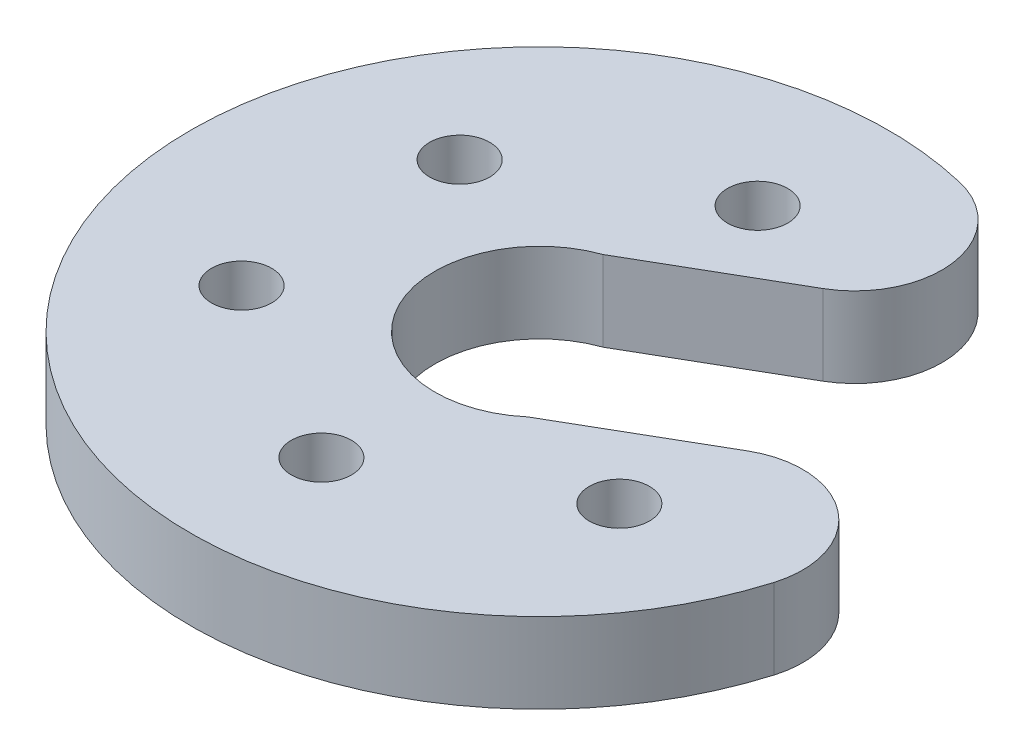
ISO-10303-21;
HEADER;
FILE_DESCRIPTION(('STEP AP214'),'2;1');
FILE_NAME('part.step','',(''),(''),'','','');
FILE_SCHEMA(('AUTOMOTIVE_DESIGN { 1 0 10303 214 1 1 1 1 }'));
ENDSEC;
DATA;
#1=APPLICATION_CONTEXT('core data for automotive mechanical design processes');
#2=APPLICATION_PROTOCOL_DEFINITION('international standard','automotive_design',2000,#1);
#3=PRODUCT_CONTEXT('',#1,'mechanical');
#4=PRODUCT('Part','Part','',(#3));
#5=PRODUCT_RELATED_PRODUCT_CATEGORY('part','',(#4));
#6=PRODUCT_DEFINITION_FORMATION('','',#4);
#7=PRODUCT_DEFINITION_CONTEXT('part definition',#1,'design');
#8=PRODUCT_DEFINITION('design','',#6,#7);
#9=PRODUCT_DEFINITION_SHAPE('','',#8);
#10=(LENGTH_UNIT() NAMED_UNIT(*) SI_UNIT(.MILLI.,.METRE.));
#11=(NAMED_UNIT(*) PLANE_ANGLE_UNIT() SI_UNIT($,.RADIAN.));
#12=(NAMED_UNIT(*) SI_UNIT($,.STERADIAN.) SOLID_ANGLE_UNIT());
#13=UNCERTAINTY_MEASURE_WITH_UNIT(LENGTH_MEASURE(1.E-05),#10,'distance_accuracy_value','');
#14=(GEOMETRIC_REPRESENTATION_CONTEXT(3) GLOBAL_UNCERTAINTY_ASSIGNED_CONTEXT((#13)) GLOBAL_UNIT_ASSIGNED_CONTEXT((#10,
#11,#12)) REPRESENTATION_CONTEXT('',''));
#15=CARTESIAN_POINT('',(0.,0.,0.));
#16=DIRECTION('',(0.,0.,1.));
#17=DIRECTION('',(1.,0.,0.));
#18=AXIS2_PLACEMENT_3D('',#15,#16,#17);
#19=CARTESIAN_POINT('',(0.,4.6,0.));
#20=DIRECTION('',(0.,1.,0.));
#21=DIRECTION('',(0.,0.,1.));
#22=AXIS2_PLACEMENT_3D('',#19,#20,#21);
#23=PLANE('',#22);
#24=CARTESIAN_POINT('',(-10.8253175473055,4.6,-6.24999999999999));
#25=DIRECTION('',(0.,1.,0.));
#26=DIRECTION('',(0.,0.,1.));
#27=AXIS2_PLACEMENT_3D('',#24,#25,#26);
#28=CIRCLE('',#27,1.72500000000015);
#29=CARTESIAN_POINT('',(-10.8253175473055,4.6,-4.52499999999984));
#30=VERTEX_POINT('',#29);
#31=EDGE_CURVE('E146',#30,#30,#28,.T.);
#32=ORIENTED_EDGE('',*,*,#31,.F.);
#33=EDGE_LOOP('',(#32));
#34=FACE_BOUND('',#33,.T.);
#35=CARTESIAN_POINT('',(0.,4.6,12.5));
#36=DIRECTION('',(0.,1.,0.));
#37=DIRECTION('',(0.,0.,1.));
#38=AXIS2_PLACEMENT_3D('',#35,#36,#37);
#39=CIRCLE('',#38,1.72500000000009);
#40=CARTESIAN_POINT('',(0.,4.6,14.2250000000001));
#41=VERTEX_POINT('',#40);
#42=EDGE_CURVE('E158',#41,#41,#39,.T.);
#43=ORIENTED_EDGE('',*,*,#42,.F.);
#44=EDGE_LOOP('',(#43));
#45=FACE_BOUND('',#44,.T.);
#46=CARTESIAN_POINT('',(0.,4.6,-12.5));
#47=DIRECTION('',(0.,1.,0.));
#48=DIRECTION('',(0.,0.,1.));
#49=AXIS2_PLACEMENT_3D('',#46,#47,#48);
#50=CIRCLE('',#49,1.725);
#51=CARTESIAN_POINT('',(0.,4.6,-10.775));
#52=VERTEX_POINT('',#51);
#53=EDGE_CURVE('E113',#52,#52,#50,.T.);
#54=ORIENTED_EDGE('',*,*,#53,.F.);
#55=EDGE_LOOP('',(#54));
#56=FACE_BOUND('',#55,.T.);
#57=CARTESIAN_POINT('',(10.8253175473055,4.6,6.25));
#58=DIRECTION('',(0.,1.,0.));
#59=DIRECTION('',(0.,0.,1.));
#60=AXIS2_PLACEMENT_3D('',#57,#58,#59);
#61=CIRCLE('',#60,1.72500000000006);
#62=CARTESIAN_POINT('',(10.8253175473055,4.6,7.97500000000006));
#63=VERTEX_POINT('',#62);
#64=EDGE_CURVE('E164',#63,#63,#61,.T.);
#65=ORIENTED_EDGE('',*,*,#64,.F.);
#66=EDGE_LOOP('',(#65));
#67=FACE_BOUND('',#66,.T.);
#68=CARTESIAN_POINT('',(-10.8253175473055,4.6,6.25000000000001));
#69=DIRECTION('',(0.,1.,0.));
#70=DIRECTION('',(0.,0.,1.));
#71=AXIS2_PLACEMENT_3D('',#68,#69,#70);
#72=CIRCLE('',#71,1.72500000000012);
#73=CARTESIAN_POINT('',(-10.8253175473055,4.6,7.97500000000013));
#74=VERTEX_POINT('',#73);
#75=EDGE_CURVE('E152',#74,#74,#72,.T.);
#76=ORIENTED_EDGE('',*,*,#75,.F.);
#77=EDGE_LOOP('',(#76));
#78=FACE_BOUND('',#77,.T.);
#79=CARTESIAN_POINT('',(0.,4.6,0.));
#80=DIRECTION('',(0.,1.,0.));
#81=DIRECTION('',(0.,0.,1.));
#82=AXIS2_PLACEMENT_3D('',#79,#80,#81);
#83=CIRCLE('',#82,20.);
#84=CARTESIAN_POINT('',(4.6323529007879,4.6,-19.4561380186964));
#85=VERTEX_POINT('',#84);
#86=CARTESIAN_POINT('',(19.1656862341212,4.6,5.71633371797131));
#87=VERTEX_POINT('',#86);
#88=EDGE_CURVE('E105',#85,#87,#83,.T.);
#89=ORIENTED_EDGE('',*,*,#88,.T.);
#90=CARTESIAN_POINT('',(14.3742646755909,4.6,4.28725028847848));
#91=DIRECTION('',(0.,1.,0.));
#92=DIRECTION('',(0.,0.,1.));
#93=AXIS2_PLACEMENT_3D('',#90,#91,#92);
#94=CIRCLE('',#93,5.);
#95=CARTESIAN_POINT('',(11.8742646755909,4.6,-0.0428767304437106));
#96=VERTEX_POINT('',#95);
#97=EDGE_CURVE('E40',#87,#96,#94,.T.);
#98=ORIENTED_EDGE('',*,*,#97,.T.);
#99=DIRECTION('',(-0.866025403784439,0.,0.5));
#100=VECTOR('',#99,1.);
#101=CARTESIAN_POINT('',(2.95,4.6,5.10954988232819));
#102=LINE('',#101,#100);
#103=CARTESIAN_POINT('',(3.89472218138457,4.59999999999999,4.56411427659639));
#104=VERTEX_POINT('',#103);
#105=EDGE_CURVE('E87',#96,#104,#102,.T.);
#106=ORIENTED_EDGE('',*,*,#105,.T.);
#107=CARTESIAN_POINT('',(0.,4.6,0.));
#108=DIRECTION('',(0.,1.,0.));
#109=DIRECTION('',(0.,0.,1.));
#110=AXIS2_PLACEMENT_3D('',#107,#108,#109);
#111=CIRCLE('',#110,6.);
#112=CARTESIAN_POINT('',(-2.00527781861544,4.6,-5.65498548805997));
#113=VERTEX_POINT('',#112);
#114=EDGE_CURVE('E90',#113,#104,#111,.T.);
#115=ORIENTED_EDGE('',*,*,#114,.F.);
#116=DIRECTION('',(0.866025403784439,0.,-0.5));
#117=VECTOR('',#116,1.);
#118=CARTESIAN_POINT('',(-2.95,4.6,-5.10954988232819));
#119=LINE('',#118,#117);
#120=CARTESIAN_POINT('',(5.97426467559093,4.6,-10.2619764951001));
#121=VERTEX_POINT('',#120);
#122=EDGE_CURVE('E132',#113,#121,#119,.T.);
#123=ORIENTED_EDGE('',*,*,#122,.T.);
#124=CARTESIAN_POINT('',(3.47426467559092,4.6,-14.5921035140223));
#125=DIRECTION('',(0.,1.,0.));
#126=DIRECTION('',(0.,0.,1.));
#127=AXIS2_PLACEMENT_3D('',#124,#125,#126);
#128=CIRCLE('',#127,5.);
#129=EDGE_CURVE('E130',#121,#85,#128,.T.);
#130=ORIENTED_EDGE('',*,*,#129,.T.);
#131=EDGE_LOOP('',(#89,#98,#106,#115,#123,#130));
#132=FACE_BOUND('',#131,.T.);
#133=ADVANCED_FACE('F32',(#34,#45,#56,#67,#78,#132),#23,.T.);
#134=CARTESIAN_POINT('',(0.,0.,0.));
#135=DIRECTION('',(0.,1.,0.));
#136=DIRECTION('',(0.,0.,1.));
#137=AXIS2_PLACEMENT_3D('',#134,#135,#136);
#138=PLANE('',#137);
#139=CARTESIAN_POINT('',(-10.8253175473055,0.,-6.24999999999999));
#140=DIRECTION('',(0.,1.,0.));
#141=DIRECTION('',(0.,0.,1.));
#142=AXIS2_PLACEMENT_3D('',#139,#140,#141);
#143=CIRCLE('',#142,1.72500000000015);
#144=CARTESIAN_POINT('',(-10.8253175473055,0.,-4.52499999999984));
#145=VERTEX_POINT('',#144);
#146=EDGE_CURVE('E142',#145,#145,#143,.T.);
#147=ORIENTED_EDGE('',*,*,#146,.T.);
#148=EDGE_LOOP('',(#147));
#149=FACE_BOUND('',#148,.T.);
#150=CARTESIAN_POINT('',(0.,0.,12.5));
#151=DIRECTION('',(0.,1.,0.));
#152=DIRECTION('',(0.,0.,1.));
#153=AXIS2_PLACEMENT_3D('',#150,#151,#152);
#154=CIRCLE('',#153,1.72500000000009);
#155=CARTESIAN_POINT('',(0.,0.,14.2250000000001));
#156=VERTEX_POINT('',#155);
#157=EDGE_CURVE('E155',#156,#156,#154,.T.);
#158=ORIENTED_EDGE('',*,*,#157,.T.);
#159=EDGE_LOOP('',(#158));
#160=FACE_BOUND('',#159,.T.);
#161=CARTESIAN_POINT('',(0.,0.,-12.5));
#162=DIRECTION('',(0.,1.,0.));
#163=DIRECTION('',(0.,0.,1.));
#164=AXIS2_PLACEMENT_3D('',#161,#162,#163);
#165=CIRCLE('',#164,1.725);
#166=CARTESIAN_POINT('',(0.,0.,-10.775));
#167=VERTEX_POINT('',#166);
#168=EDGE_CURVE('E116',#167,#167,#165,.T.);
#169=ORIENTED_EDGE('',*,*,#168,.T.);
#170=EDGE_LOOP('',(#169));
#171=FACE_BOUND('',#170,.T.);
#172=CARTESIAN_POINT('',(10.8253175473055,0.,6.25));
#173=DIRECTION('',(0.,1.,0.));
#174=DIRECTION('',(0.,0.,1.));
#175=AXIS2_PLACEMENT_3D('',#172,#173,#174);
#176=CIRCLE('',#175,1.72500000000006);
#177=CARTESIAN_POINT('',(10.8253175473055,0.,7.97500000000006));
#178=VERTEX_POINT('',#177);
#179=EDGE_CURVE('E161',#178,#178,#176,.T.);
#180=ORIENTED_EDGE('',*,*,#179,.T.);
#181=EDGE_LOOP('',(#180));
#182=FACE_BOUND('',#181,.T.);
#183=CARTESIAN_POINT('',(-10.8253175473055,0.,6.25000000000001));
#184=DIRECTION('',(0.,1.,0.));
#185=DIRECTION('',(0.,0.,1.));
#186=AXIS2_PLACEMENT_3D('',#183,#184,#185);
#187=CIRCLE('',#186,1.72500000000012);
#188=CARTESIAN_POINT('',(-10.8253175473055,0.,7.97500000000013));
#189=VERTEX_POINT('',#188);
#190=EDGE_CURVE('E149',#189,#189,#187,.T.);
#191=ORIENTED_EDGE('',*,*,#190,.T.);
#192=EDGE_LOOP('',(#191));
#193=FACE_BOUND('',#192,.T.);
#194=DIRECTION('',(-0.866025403784439,0.,0.5));
#195=VECTOR('',#194,1.);
#196=CARTESIAN_POINT('',(2.95,0.,5.10954988232819));
#197=LINE('',#196,#195);
#198=CARTESIAN_POINT('',(11.8742646755909,0.,-0.0428767304437106));
#199=VERTEX_POINT('',#198);
#200=CARTESIAN_POINT('',(3.89472218138458,0.,4.56411427659639));
#201=VERTEX_POINT('',#200);
#202=EDGE_CURVE('E96',#199,#201,#197,.T.);
#203=ORIENTED_EDGE('',*,*,#202,.F.);
#204=CARTESIAN_POINT('',(14.3742646755909,0.,4.28725028847848));
#205=DIRECTION('',(0.,1.,0.));
#206=DIRECTION('',(0.,0.,1.));
#207=AXIS2_PLACEMENT_3D('',#204,#205,#206);
#208=CIRCLE('',#207,5.);
#209=CARTESIAN_POINT('',(19.1656862341212,0.,5.71633371797131));
#210=VERTEX_POINT('',#209);
#211=EDGE_CURVE('E124',#199,#210,#208,.F.);
#212=ORIENTED_EDGE('',*,*,#211,.T.);
#213=CARTESIAN_POINT('',(0.,0.,0.));
#214=DIRECTION('',(0.,1.,0.));
#215=DIRECTION('',(0.,0.,1.));
#216=AXIS2_PLACEMENT_3D('',#213,#214,#215);
#217=CIRCLE('',#216,20.);
#218=CARTESIAN_POINT('',(4.6323529007879,0.,-19.4561380186964));
#219=VERTEX_POINT('',#218);
#220=EDGE_CURVE('E109',#219,#210,#217,.T.);
#221=ORIENTED_EDGE('',*,*,#220,.F.);
#222=CARTESIAN_POINT('',(3.47426467559092,0.,-14.5921035140223));
#223=DIRECTION('',(0.,1.,0.));
#224=DIRECTION('',(0.,0.,1.));
#225=AXIS2_PLACEMENT_3D('',#222,#223,#224);
#226=CIRCLE('',#225,5.);
#227=CARTESIAN_POINT('',(5.97426467559093,0.,-10.2619764951001));
#228=VERTEX_POINT('',#227);
#229=EDGE_CURVE('E122',#219,#228,#226,.F.);
#230=ORIENTED_EDGE('',*,*,#229,.T.);
#231=DIRECTION('',(0.866025403784439,0.,-0.5));
#232=VECTOR('',#231,1.);
#233=CARTESIAN_POINT('',(-2.95,0.,-5.10954988232819));
#234=LINE('',#233,#232);
#235=CARTESIAN_POINT('',(-2.00527781861544,0.,-5.65498548805997));
#236=VERTEX_POINT('',#235);
#237=EDGE_CURVE('E95',#236,#228,#234,.T.);
#238=ORIENTED_EDGE('',*,*,#237,.F.);
#239=CARTESIAN_POINT('',(0.,0.,0.));
#240=DIRECTION('',(0.,1.,0.));
#241=DIRECTION('',(0.,0.,1.));
#242=AXIS2_PLACEMENT_3D('',#239,#240,#241);
#243=CIRCLE('',#242,6.);
#244=EDGE_CURVE('E110',#236,#201,#243,.T.);
#245=ORIENTED_EDGE('',*,*,#244,.T.);
#246=EDGE_LOOP('',(#203,#212,#221,#230,#238,#245));
#247=FACE_BOUND('',#246,.T.);
#248=ADVANCED_FACE('F139',(#149,#160,#171,#182,#193,#247),#138,.F.);
#249=CARTESIAN_POINT('',(0.,4.6,0.));
#250=DIRECTION('',(0.,-1.,0.));
#251=DIRECTION('',(0.,0.,-1.));
#252=AXIS2_PLACEMENT_3D('',#249,#250,#251);
#253=CYLINDRICAL_SURFACE('',#252,20.);
#254=ORIENTED_EDGE('',*,*,#220,.T.);
#255=DIRECTION('',(0.,-1.,0.));
#256=VECTOR('',#255,1.);
#257=CARTESIAN_POINT('',(19.1656862341212,4.6,5.71633371797131));
#258=LINE('',#257,#256);
#259=EDGE_CURVE('E53',#210,#87,#258,.F.);
#260=ORIENTED_EDGE('',*,*,#259,.T.);
#261=ORIENTED_EDGE('',*,*,#88,.F.);
#262=DIRECTION('',(0.,-1.,0.));
#263=VECTOR('',#262,1.);
#264=CARTESIAN_POINT('',(4.6323529007879,4.6,-19.4561380186964));
#265=LINE('',#264,#263);
#266=EDGE_CURVE('E126',#85,#219,#265,.T.);
#267=ORIENTED_EDGE('',*,*,#266,.T.);
#268=EDGE_LOOP('',(#254,#260,#261,#267));
#269=FACE_BOUND('',#268,.T.);
#270=ADVANCED_FACE('F135',(#269),#253,.T.);
#271=CARTESIAN_POINT('',(0.,4.6,0.));
#272=DIRECTION('',(0.,-1.,0.));
#273=DIRECTION('',(0.,0.,-1.));
#274=AXIS2_PLACEMENT_3D('',#271,#272,#273);
#275=CYLINDRICAL_SURFACE('',#274,6.);
#276=DIRECTION('',(0.,-1.,0.));
#277=VECTOR('',#276,1.);
#278=CARTESIAN_POINT('',(-2.00527781861544,75.5440800912945,-5.65498548805997));
#279=LINE('',#278,#277);
#280=EDGE_CURVE('E104',#113,#236,#279,.T.);
#281=ORIENTED_EDGE('',*,*,#280,.F.);
#282=ORIENTED_EDGE('',*,*,#114,.T.);
#283=DIRECTION('',(0.,-1.,0.));
#284=VECTOR('',#283,1.);
#285=CARTESIAN_POINT('',(3.89472218138458,4.6,4.56411427659639));
#286=LINE('',#285,#284);
#287=EDGE_CURVE('E99',#104,#201,#286,.T.);
#288=ORIENTED_EDGE('',*,*,#287,.T.);
#289=ORIENTED_EDGE('',*,*,#244,.F.);
#290=EDGE_LOOP('',(#281,#282,#288,#289));
#291=FACE_BOUND('',#290,.T.);
#292=ADVANCED_FACE('F107',(#291),#275,.F.);
#293=CARTESIAN_POINT('',(0.,4.6,-12.5));
#294=DIRECTION('',(0.,-1.,0.));
#295=DIRECTION('',(0.,0.,-1.));
#296=AXIS2_PLACEMENT_3D('',#293,#294,#295);
#297=CYLINDRICAL_SURFACE('',#296,1.725);
#298=ORIENTED_EDGE('',*,*,#53,.T.);
#299=EDGE_LOOP('',(#298));
#300=FACE_BOUND('',#299,.T.);
#301=ORIENTED_EDGE('',*,*,#168,.F.);
#302=EDGE_LOOP('',(#301));
#303=FACE_BOUND('',#302,.T.);
#304=ADVANCED_FACE('F176',(#300,#303),#297,.F.);
#305=CARTESIAN_POINT('',(10.8253175473055,4.6,6.25));
#306=DIRECTION('',(0.,-1.,0.));
#307=DIRECTION('',(0.,0.,-1.));
#308=AXIS2_PLACEMENT_3D('',#305,#306,#307);
#309=CYLINDRICAL_SURFACE('',#308,1.72500000000006);
#310=ORIENTED_EDGE('',*,*,#64,.T.);
#311=EDGE_LOOP('',(#310));
#312=FACE_BOUND('',#311,.T.);
#313=ORIENTED_EDGE('',*,*,#179,.F.);
#314=EDGE_LOOP('',(#313));
#315=FACE_BOUND('',#314,.T.);
#316=ADVANCED_FACE('F178',(#312,#315),#309,.F.);
#317=CARTESIAN_POINT('',(0.,4.6,12.5));
#318=DIRECTION('',(0.,-1.,0.));
#319=DIRECTION('',(0.,0.,-1.));
#320=AXIS2_PLACEMENT_3D('',#317,#318,#319);
#321=CYLINDRICAL_SURFACE('',#320,1.72500000000009);
#322=ORIENTED_EDGE('',*,*,#42,.T.);
#323=EDGE_LOOP('',(#322));
#324=FACE_BOUND('',#323,.T.);
#325=ORIENTED_EDGE('',*,*,#157,.F.);
#326=EDGE_LOOP('',(#325));
#327=FACE_BOUND('',#326,.T.);
#328=ADVANCED_FACE('F184',(#324,#327),#321,.F.);
#329=CARTESIAN_POINT('',(-10.8253175473055,4.6,6.25000000000001));
#330=DIRECTION('',(0.,-1.,0.));
#331=DIRECTION('',(0.,0.,-1.));
#332=AXIS2_PLACEMENT_3D('',#329,#330,#331);
#333=CYLINDRICAL_SURFACE('',#332,1.72500000000012);
#334=ORIENTED_EDGE('',*,*,#75,.T.);
#335=EDGE_LOOP('',(#334));
#336=FACE_BOUND('',#335,.T.);
#337=ORIENTED_EDGE('',*,*,#190,.F.);
#338=EDGE_LOOP('',(#337));
#339=FACE_BOUND('',#338,.T.);
#340=ADVANCED_FACE('F217',(#336,#339),#333,.F.);
#341=CARTESIAN_POINT('',(-10.8253175473055,4.6,-6.24999999999999));
#342=DIRECTION('',(0.,-1.,0.));
#343=DIRECTION('',(0.,0.,-1.));
#344=AXIS2_PLACEMENT_3D('',#341,#342,#343);
#345=CYLINDRICAL_SURFACE('',#344,1.72500000000015);
#346=ORIENTED_EDGE('',*,*,#31,.T.);
#347=EDGE_LOOP('',(#346));
#348=FACE_BOUND('',#347,.T.);
#349=ORIENTED_EDGE('',*,*,#146,.F.);
#350=EDGE_LOOP('',(#349));
#351=FACE_BOUND('',#350,.T.);
#352=ADVANCED_FACE('F212',(#348,#351),#345,.F.);
#353=CARTESIAN_POINT('',(3.89472218138457,75.5440800912945,4.56411427659639));
#354=DIRECTION('',(-0.5,0.,-0.866025403784438));
#355=DIRECTION('',(-0.866025403784439,0.,0.5));
#356=AXIS2_PLACEMENT_3D('',#353,#354,#355);
#357=PLANE('',#356);
#358=ORIENTED_EDGE('',*,*,#105,.F.);
#359=DIRECTION('',(0.,1.,0.));
#360=VECTOR('',#359,1.);
#361=CARTESIAN_POINT('',(11.8742646755909,0.,-0.0428767304437079));
#362=LINE('',#361,#360);
#363=EDGE_CURVE('E120',#96,#199,#362,.F.);
#364=ORIENTED_EDGE('',*,*,#363,.T.);
#365=ORIENTED_EDGE('',*,*,#202,.T.);
#366=ORIENTED_EDGE('',*,*,#287,.F.);
#367=EDGE_LOOP('',(#358,#364,#365,#366));
#368=FACE_BOUND('',#367,.T.);
#369=ADVANCED_FACE('F100',(#368),#357,.T.);
#370=CARTESIAN_POINT('',(-2.00527781861544,75.5440800912945,-5.65498548805997));
#371=DIRECTION('',(0.5,0.,0.866025403784438));
#372=DIRECTION('',(0.866025403784439,0.,-0.5));
#373=AXIS2_PLACEMENT_3D('',#370,#371,#372);
#374=PLANE('',#373);
#375=ORIENTED_EDGE('',*,*,#237,.T.);
#376=DIRECTION('',(0.,1.,0.));
#377=VECTOR('',#376,1.);
#378=CARTESIAN_POINT('',(5.97426467559093,4.6,-10.2619764951001));
#379=LINE('',#378,#377);
#380=EDGE_CURVE('E11',#228,#121,#379,.T.);
#381=ORIENTED_EDGE('',*,*,#380,.T.);
#382=ORIENTED_EDGE('',*,*,#122,.F.);
#383=ORIENTED_EDGE('',*,*,#280,.T.);
#384=EDGE_LOOP('',(#375,#381,#382,#383));
#385=FACE_BOUND('',#384,.T.);
#386=ADVANCED_FACE('F140',(#385),#374,.T.);
#387=CARTESIAN_POINT('',(14.3742646755909,4.6,4.28725028847848));
#388=DIRECTION('',(0.,-1.,0.));
#389=DIRECTION('',(0.,0.,-1.));
#390=AXIS2_PLACEMENT_3D('',#387,#388,#389);
#391=CYLINDRICAL_SURFACE('',#390,5.);
#392=ORIENTED_EDGE('',*,*,#97,.F.);
#393=ORIENTED_EDGE('',*,*,#259,.F.);
#394=ORIENTED_EDGE('',*,*,#211,.F.);
#395=ORIENTED_EDGE('',*,*,#363,.F.);
#396=EDGE_LOOP('',(#392,#393,#394,#395));
#397=FACE_BOUND('',#396,.T.);
#398=ADVANCED_FACE('F200',(#397),#391,.T.);
#399=CARTESIAN_POINT('',(3.47426467559092,4.6,-14.5921035140223));
#400=DIRECTION('',(0.,-1.,0.));
#401=DIRECTION('',(0.,0.,-1.));
#402=AXIS2_PLACEMENT_3D('',#399,#400,#401);
#403=CYLINDRICAL_SURFACE('',#402,5.);
#404=ORIENTED_EDGE('',*,*,#129,.F.);
#405=ORIENTED_EDGE('',*,*,#380,.F.);
#406=ORIENTED_EDGE('',*,*,#229,.F.);
#407=ORIENTED_EDGE('',*,*,#266,.F.);
#408=EDGE_LOOP('',(#404,#405,#406,#407));
#409=FACE_BOUND('',#408,.T.);
#410=ADVANCED_FACE('F34',(#409),#403,.T.);
#411=CLOSED_SHELL('',(#133,#248,#270,#292,#304,#316,#328,#340,#352,#369,#386,#398,#410));
#412=MANIFOLD_SOLID_BREP('B2',#411);
#413=ADVANCED_BREP_SHAPE_REPRESENTATION('',(#18,#412),#14);
#414=SHAPE_DEFINITION_REPRESENTATION(#9,#413);
ENDSEC;
END-ISO-10303-21;
